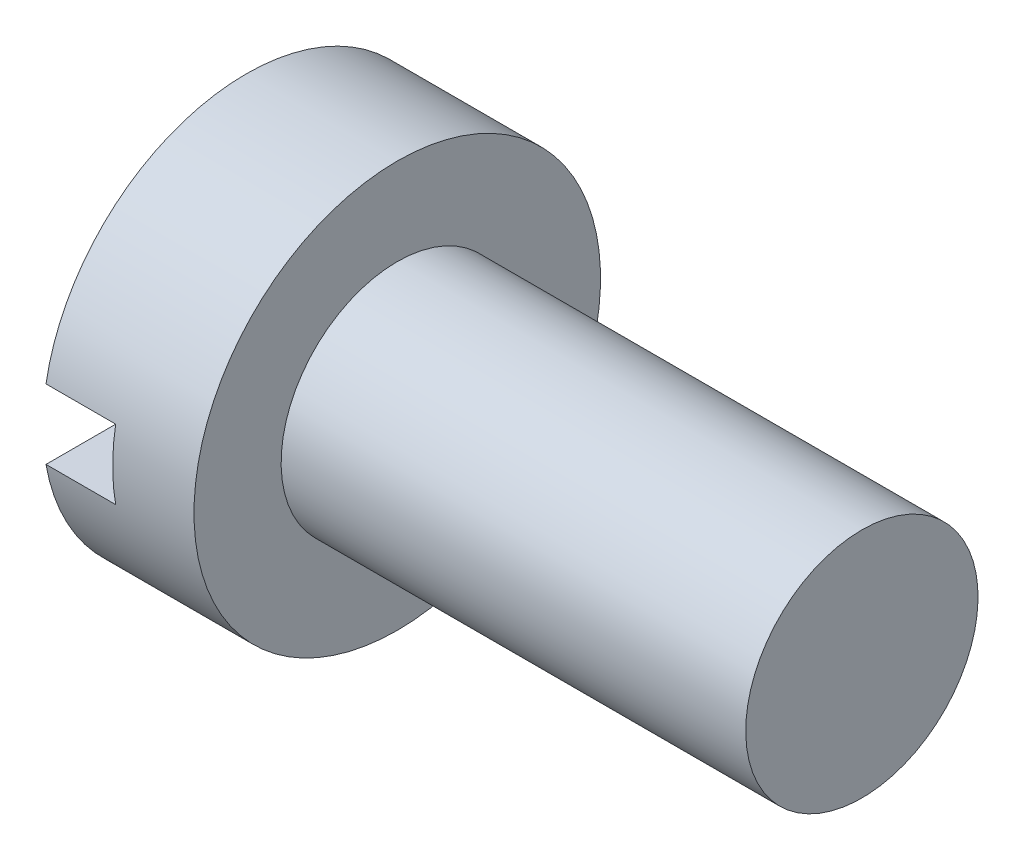
ISO-10303-21;
HEADER;
FILE_DESCRIPTION(('STEP AP214'),'2;1');
FILE_NAME('part.step','',(''),(''),'','','');
FILE_SCHEMA(('AUTOMOTIVE_DESIGN { 1 0 10303 214 1 1 1 1 }'));
ENDSEC;
DATA;
#1=APPLICATION_CONTEXT('core data for automotive mechanical design processes');
#2=APPLICATION_PROTOCOL_DEFINITION('international standard','automotive_design',2000,#1);
#3=PRODUCT_CONTEXT('',#1,'mechanical');
#4=PRODUCT('Part','Part','',(#3));
#5=PRODUCT_RELATED_PRODUCT_CATEGORY('part','',(#4));
#6=PRODUCT_DEFINITION_FORMATION('','',#4);
#7=PRODUCT_DEFINITION_CONTEXT('part definition',#1,'design');
#8=PRODUCT_DEFINITION('design','',#6,#7);
#9=PRODUCT_DEFINITION_SHAPE('','',#8);
#10=(LENGTH_UNIT() NAMED_UNIT(*) SI_UNIT(.MILLI.,.METRE.));
#11=(NAMED_UNIT(*) PLANE_ANGLE_UNIT() SI_UNIT($,.RADIAN.));
#12=(NAMED_UNIT(*) SI_UNIT($,.STERADIAN.) SOLID_ANGLE_UNIT());
#13=UNCERTAINTY_MEASURE_WITH_UNIT(LENGTH_MEASURE(1.E-05),#10,'distance_accuracy_value','');
#14=(GEOMETRIC_REPRESENTATION_CONTEXT(3) GLOBAL_UNCERTAINTY_ASSIGNED_CONTEXT((#13)) GLOBAL_UNIT_ASSIGNED_CONTEXT((#10,
#11,#12)) REPRESENTATION_CONTEXT('',''));
#15=CARTESIAN_POINT('',(0.,0.,0.));
#16=DIRECTION('',(0.,0.,1.));
#17=DIRECTION('',(1.,0.,0.));
#18=AXIS2_PLACEMENT_3D('',#15,#16,#17);
#19=CARTESIAN_POINT('',(0.,0.,0.));
#20=DIRECTION('',(-1.,0.,0.));
#21=DIRECTION('',(0.,-1.,0.));
#22=AXIS2_PLACEMENT_3D('',#19,#20,#21);
#23=PLANE('',#22);
#24=DIRECTION('',(0.,0.,-1.));
#25=VECTOR('',#24,1.);
#26=CARTESIAN_POINT('',(0.,0.599999999999996,-3.5));
#27=LINE('',#26,#25);
#28=CARTESIAN_POINT('',(0.,0.599999999999999,3.44818792991333));
#29=VERTEX_POINT('',#28);
#30=CARTESIAN_POINT('',(0.,0.599999999999996,-3.44818792991333));
#31=VERTEX_POINT('',#30);
#32=EDGE_CURVE('E83',#29,#31,#27,.T.);
#33=ORIENTED_EDGE('',*,*,#32,.F.);
#34=CARTESIAN_POINT('',(0.,0.,0.));
#35=DIRECTION('',(1.,0.,0.));
#36=DIRECTION('',(0.,1.,0.));
#37=AXIS2_PLACEMENT_3D('',#34,#35,#36);
#38=CIRCLE('',#37,3.5);
#39=EDGE_CURVE('E89',#31,#29,#38,.T.);
#40=ORIENTED_EDGE('',*,*,#39,.F.);
#41=EDGE_LOOP('',(#33,#40));
#42=FACE_BOUND('',#41,.T.);
#43=ADVANCED_FACE('F33',(#42),#23,.T.);
#44=DIRECTION('',(0.,0.,1.));
#45=VECTOR('',#44,1.);
#46=CARTESIAN_POINT('',(0.,-0.600000000000001,-3.5));
#47=LINE('',#46,#45);
#48=CARTESIAN_POINT('',(0.,-0.600000000000001,-3.44818792991333));
#49=VERTEX_POINT('',#48);
#50=CARTESIAN_POINT('',(0.,-0.599999999999999,3.44818792991333));
#51=VERTEX_POINT('',#50);
#52=EDGE_CURVE('E77',#49,#51,#47,.T.);
#53=ORIENTED_EDGE('',*,*,#52,.F.);
#54=EDGE_CURVE('E82',#51,#49,#38,.T.);
#55=ORIENTED_EDGE('',*,*,#54,.F.);
#56=EDGE_LOOP('',(#53,#55));
#57=FACE_BOUND('',#56,.T.);
#58=ADVANCED_FACE('F35',(#57),#23,.T.);
#59=CARTESIAN_POINT('',(10.6,0.,0.));
#60=DIRECTION('',(1.,0.,0.));
#61=DIRECTION('',(0.,1.,0.));
#62=AXIS2_PLACEMENT_3D('',#59,#60,#61);
#63=CYLINDRICAL_SURFACE('',#62,3.5);
#64=DIRECTION('',(1.,0.,0.));
#65=VECTOR('',#64,1.);
#66=CARTESIAN_POINT('',(10.6,0.599999999999996,-3.44818792991333));
#67=LINE('',#66,#65);
#68=CARTESIAN_POINT('',(1.2,0.599999999999996,-3.44818792991333));
#69=VERTEX_POINT('',#68);
#70=EDGE_CURVE('E11',#31,#69,#67,.T.);
#71=ORIENTED_EDGE('',*,*,#70,.F.);
#72=ORIENTED_EDGE('',*,*,#39,.T.);
#73=DIRECTION('',(1.,0.,0.));
#74=VECTOR('',#73,1.);
#75=CARTESIAN_POINT('',(10.6,0.599999999999999,3.44818792991333));
#76=LINE('',#75,#74);
#77=CARTESIAN_POINT('',(1.2,0.599999999999999,3.44818792991333));
#78=VERTEX_POINT('',#77);
#79=EDGE_CURVE('E98',#78,#29,#76,.F.);
#80=ORIENTED_EDGE('',*,*,#79,.F.);
#81=CARTESIAN_POINT('',(1.2,0.,0.));
#82=DIRECTION('',(-1.,0.,0.));
#83=DIRECTION('',(0.,0.,1.));
#84=AXIS2_PLACEMENT_3D('',#81,#82,#83);
#85=CIRCLE('',#84,3.5);
#86=CARTESIAN_POINT('',(1.2,-0.599999999999999,3.44818792991333));
#87=VERTEX_POINT('',#86);
#88=EDGE_CURVE('E48',#78,#87,#85,.F.);
#89=ORIENTED_EDGE('',*,*,#88,.T.);
#90=DIRECTION('',(1.,0.,0.));
#91=VECTOR('',#90,1.);
#92=CARTESIAN_POINT('',(10.6,-0.599999999999999,3.44818792991333));
#93=LINE('',#92,#91);
#94=EDGE_CURVE('E88',#51,#87,#93,.T.);
#95=ORIENTED_EDGE('',*,*,#94,.F.);
#96=ORIENTED_EDGE('',*,*,#54,.T.);
#97=DIRECTION('',(1.,0.,0.));
#98=VECTOR('',#97,1.);
#99=CARTESIAN_POINT('',(10.6,-0.600000000000001,-3.44818792991333));
#100=LINE('',#99,#98);
#101=CARTESIAN_POINT('',(1.2,-0.600000000000001,-3.44818792991333));
#102=VERTEX_POINT('',#101);
#103=EDGE_CURVE('E41',#102,#49,#100,.F.);
#104=ORIENTED_EDGE('',*,*,#103,.F.);
#105=EDGE_CURVE('E56',#102,#69,#85,.F.);
#106=ORIENTED_EDGE('',*,*,#105,.T.);
#107=EDGE_LOOP('',(#71,#72,#80,#89,#95,#96,#104,#106));
#108=FACE_BOUND('',#107,.T.);
#109=CARTESIAN_POINT('',(2.6,0.,0.));
#110=DIRECTION('',(1.,0.,0.));
#111=DIRECTION('',(0.,1.,0.));
#112=AXIS2_PLACEMENT_3D('',#109,#110,#111);
#113=CIRCLE('',#112,3.5);
#114=CARTESIAN_POINT('',(2.6,3.5,0.));
#115=VERTEX_POINT('',#114);
#116=EDGE_CURVE('E93',#115,#115,#113,.T.);
#117=ORIENTED_EDGE('',*,*,#116,.F.);
#118=EDGE_LOOP('',(#117));
#119=FACE_BOUND('',#118,.T.);
#120=ADVANCED_FACE('F86',(#108,#119),#63,.T.);
#121=CARTESIAN_POINT('',(2.6,3.5,0.));
#122=DIRECTION('',(1.,0.,0.));
#123=DIRECTION('',(0.,1.,0.));
#124=AXIS2_PLACEMENT_3D('',#121,#122,#123);
#125=PLANE('',#124);
#126=ORIENTED_EDGE('',*,*,#116,.T.);
#127=EDGE_LOOP('',(#126));
#128=FACE_BOUND('',#127,.T.);
#129=CARTESIAN_POINT('',(2.6,0.,0.));
#130=DIRECTION('',(1.,0.,0.));
#131=DIRECTION('',(0.,1.,0.));
#132=AXIS2_PLACEMENT_3D('',#129,#130,#131);
#133=CIRCLE('',#132,2.);
#134=CARTESIAN_POINT('',(2.6,2.,0.));
#135=VERTEX_POINT('',#134);
#136=EDGE_CURVE('E111',#135,#135,#133,.T.);
#137=ORIENTED_EDGE('',*,*,#136,.F.);
#138=EDGE_LOOP('',(#137));
#139=FACE_BOUND('',#138,.T.);
#140=ADVANCED_FACE('F118',(#128,#139),#125,.T.);
#141=CARTESIAN_POINT('',(10.6,0.,0.));
#142=DIRECTION('',(1.,0.,0.));
#143=DIRECTION('',(0.,1.,0.));
#144=AXIS2_PLACEMENT_3D('',#141,#142,#143);
#145=CYLINDRICAL_SURFACE('',#144,2.);
#146=ORIENTED_EDGE('',*,*,#136,.T.);
#147=EDGE_LOOP('',(#146));
#148=FACE_BOUND('',#147,.T.);
#149=CARTESIAN_POINT('',(10.6,0.,0.));
#150=DIRECTION('',(1.,0.,0.));
#151=DIRECTION('',(0.,1.,0.));
#152=AXIS2_PLACEMENT_3D('',#149,#150,#151);
#153=CIRCLE('',#152,2.);
#154=CARTESIAN_POINT('',(10.6,2.,0.));
#155=VERTEX_POINT('',#154);
#156=EDGE_CURVE('E109',#155,#155,#153,.T.);
#157=ORIENTED_EDGE('',*,*,#156,.F.);
#158=EDGE_LOOP('',(#157));
#159=FACE_BOUND('',#158,.T.);
#160=ADVANCED_FACE('F125',(#148,#159),#145,.T.);
#161=CARTESIAN_POINT('',(10.6,2.,0.));
#162=DIRECTION('',(1.,0.,0.));
#163=DIRECTION('',(0.,1.,0.));
#164=AXIS2_PLACEMENT_3D('',#161,#162,#163);
#165=PLANE('',#164);
#166=ORIENTED_EDGE('',*,*,#156,.T.);
#167=EDGE_LOOP('',(#166));
#168=FACE_BOUND('',#167,.T.);
#169=ADVANCED_FACE('F150',(#168),#165,.T.);
#170=CARTESIAN_POINT('',(1.2,0.599999999999996,-3.5));
#171=DIRECTION('',(0.,1.,0.));
#172=DIRECTION('',(0.,0.,1.));
#173=AXIS2_PLACEMENT_3D('',#170,#171,#172);
#174=PLANE('',#173);
#175=ORIENTED_EDGE('',*,*,#79,.T.);
#176=ORIENTED_EDGE('',*,*,#32,.T.);
#177=ORIENTED_EDGE('',*,*,#70,.T.);
#178=DIRECTION('',(0.,0.,-1.));
#179=VECTOR('',#178,1.);
#180=CARTESIAN_POINT('',(1.2,0.599999999999996,-3.5));
#181=LINE('',#180,#179);
#182=EDGE_CURVE('E105',#78,#69,#181,.T.);
#183=ORIENTED_EDGE('',*,*,#182,.F.);
#184=EDGE_LOOP('',(#175,#176,#177,#183));
#185=FACE_BOUND('',#184,.T.);
#186=ADVANCED_FACE('F145',(#185),#174,.F.);
#187=CARTESIAN_POINT('',(1.2,-0.600000000000001,-3.5));
#188=DIRECTION('',(0.,-1.,0.));
#189=DIRECTION('',(0.,0.,-1.));
#190=AXIS2_PLACEMENT_3D('',#187,#188,#189);
#191=PLANE('',#190);
#192=ORIENTED_EDGE('',*,*,#103,.T.);
#193=ORIENTED_EDGE('',*,*,#52,.T.);
#194=ORIENTED_EDGE('',*,*,#94,.T.);
#195=DIRECTION('',(0.,0.,1.));
#196=VECTOR('',#195,1.);
#197=CARTESIAN_POINT('',(1.2,-0.600000000000001,-3.5));
#198=LINE('',#197,#196);
#199=EDGE_CURVE('E78',#102,#87,#198,.T.);
#200=ORIENTED_EDGE('',*,*,#199,.F.);
#201=EDGE_LOOP('',(#192,#193,#194,#200));
#202=FACE_BOUND('',#201,.T.);
#203=ADVANCED_FACE('F76',(#202),#191,.F.);
#204=CARTESIAN_POINT('',(1.2,0.,0.));
#205=DIRECTION('',(-1.,0.,0.));
#206=DIRECTION('',(0.,0.,1.));
#207=AXIS2_PLACEMENT_3D('',#204,#205,#206);
#208=PLANE('',#207);
#209=ORIENTED_EDGE('',*,*,#199,.T.);
#210=ORIENTED_EDGE('',*,*,#88,.F.);
#211=ORIENTED_EDGE('',*,*,#182,.T.);
#212=ORIENTED_EDGE('',*,*,#105,.F.);
#213=EDGE_LOOP('',(#209,#210,#211,#212));
#214=FACE_BOUND('',#213,.T.);
#215=ADVANCED_FACE('F160',(#214),#208,.T.);
#216=CLOSED_SHELL('',(#43,#58,#120,#140,#160,#169,#186,#203,#215));
#217=MANIFOLD_SOLID_BREP('B2',#216);
#218=ADVANCED_BREP_SHAPE_REPRESENTATION('',(#18,#217),#14);
#219=SHAPE_DEFINITION_REPRESENTATION(#9,#218);
ENDSEC;
END-ISO-10303-21;
